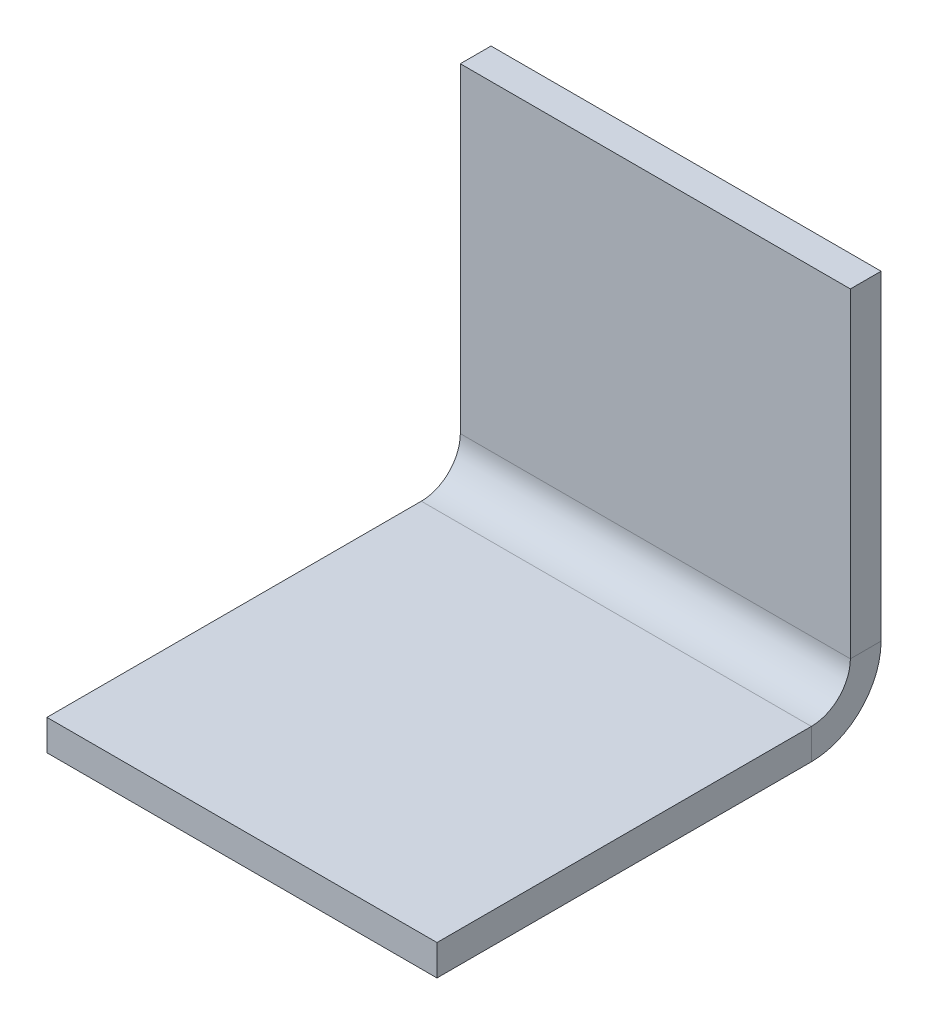
ISO-10303-21;
HEADER;
FILE_DESCRIPTION(('STEP AP214'),'2;1');
FILE_NAME('part.step','',(''),(''),'','','');
FILE_SCHEMA(('AUTOMOTIVE_DESIGN { 1 0 10303 214 1 1 1 1 }'));
ENDSEC;
DATA;
#1=APPLICATION_CONTEXT('core data for automotive mechanical design processes');
#2=APPLICATION_PROTOCOL_DEFINITION('international standard','automotive_design',2000,#1);
#3=PRODUCT_CONTEXT('',#1,'mechanical');
#4=PRODUCT('Part','Part','',(#3));
#5=PRODUCT_RELATED_PRODUCT_CATEGORY('part','',(#4));
#6=PRODUCT_DEFINITION_FORMATION('','',#4);
#7=PRODUCT_DEFINITION_CONTEXT('part definition',#1,'design');
#8=PRODUCT_DEFINITION('design','',#6,#7);
#9=PRODUCT_DEFINITION_SHAPE('','',#8);
#10=(LENGTH_UNIT() NAMED_UNIT(*) SI_UNIT(.MILLI.,.METRE.));
#11=(NAMED_UNIT(*) PLANE_ANGLE_UNIT() SI_UNIT($,.RADIAN.));
#12=(NAMED_UNIT(*) SI_UNIT($,.STERADIAN.) SOLID_ANGLE_UNIT());
#13=UNCERTAINTY_MEASURE_WITH_UNIT(LENGTH_MEASURE(1.E-05),#10,'distance_accuracy_value','');
#14=(GEOMETRIC_REPRESENTATION_CONTEXT(3) GLOBAL_UNCERTAINTY_ASSIGNED_CONTEXT((#13)) GLOBAL_UNIT_ASSIGNED_CONTEXT((#10,
#11,#12)) REPRESENTATION_CONTEXT('',''));
#15=CARTESIAN_POINT('',(0.,0.,0.));
#16=DIRECTION('',(0.,0.,1.));
#17=DIRECTION('',(1.,0.,0.));
#18=AXIS2_PLACEMENT_3D('',#15,#16,#17);
#19=CARTESIAN_POINT('',(0.,9.31212121212122,10.8315022152673));
#20=DIRECTION('',(0.,-1.,0.));
#21=DIRECTION('',(-1.,0.,0.));
#22=AXIS2_PLACEMENT_3D('',#19,#20,#21);
#23=PLANE('',#22);
#24=DIRECTION('',(0.,0.,-1.));
#25=VECTOR('',#24,1.);
#26=CARTESIAN_POINT('',(7.95353535353538,9.31212121212119,3.00624969001473));
#27=LINE('',#26,#25);
#28=CARTESIAN_POINT('',(7.95353535353538,9.31212121212128,28.919381003146));
#29=VERTEX_POINT('',#28);
#30=CARTESIAN_POINT('',(7.95353535353538,9.31212121212119,4.54000000000001));
#31=VERTEX_POINT('',#30);
#32=EDGE_CURVE('E54',#29,#31,#27,.T.);
#33=ORIENTED_EDGE('',*,*,#32,.T.);
#34=DIRECTION('',(-1.,0.,0.));
#35=VECTOR('',#34,1.);
#36=CARTESIAN_POINT('',(0.,9.31212121212119,4.54000000000002));
#37=LINE('',#36,#35);
#38=CARTESIAN_POINT('',(-17.4464646464646,9.3121212121212,4.54000000000001));
#39=VERTEX_POINT('',#38);
#40=EDGE_CURVE('E190',#31,#39,#37,.T.);
#41=ORIENTED_EDGE('',*,*,#40,.T.);
#42=DIRECTION('',(0.,0.,1.));
#43=VECTOR('',#42,1.);
#44=CARTESIAN_POINT('',(-17.4464646464646,9.31212121212111,-21.8806189968539));
#45=LINE('',#44,#43);
#46=CARTESIAN_POINT('',(-17.4464646464646,9.31212121212128,28.919381003146));
#47=VERTEX_POINT('',#46);
#48=EDGE_CURVE('E175',#39,#47,#45,.T.);
#49=ORIENTED_EDGE('',*,*,#48,.T.);
#50=DIRECTION('',(1.,0.,0.));
#51=VECTOR('',#50,1.);
#52=CARTESIAN_POINT('',(7.95353535353538,9.31212121212128,28.919381003146));
#53=LINE('',#52,#51);
#54=EDGE_CURVE('E179',#47,#29,#53,.T.);
#55=ORIENTED_EDGE('',*,*,#54,.T.);
#56=EDGE_LOOP('',(#33,#41,#49,#55));
#57=FACE_BOUND('',#56,.T.);
#58=ADVANCED_FACE('F50',(#57),#23,.F.);
#59=CARTESIAN_POINT('',(7.95353535353538,9.31212121212119,3.00624969001473));
#60=DIRECTION('',(-1.,0.,0.));
#61=DIRECTION('',(0.,0.,-1.));
#62=AXIS2_PLACEMENT_3D('',#59,#60,#61);
#63=PLANE('',#62);
#64=DIRECTION('',(0.,-1.,0.));
#65=VECTOR('',#64,1.);
#66=CARTESIAN_POINT('',(7.95353535353538,9.31212121212118,4.54000000000002));
#67=LINE('',#66,#65);
#68=CARTESIAN_POINT('',(7.95353535353538,7.31212121212119,4.54000000000001));
#69=VERTEX_POINT('',#68);
#70=EDGE_CURVE('E158',#31,#69,#67,.T.);
#71=ORIENTED_EDGE('',*,*,#70,.F.);
#72=ORIENTED_EDGE('',*,*,#32,.F.);
#73=DIRECTION('',(0.,1.,0.));
#74=VECTOR('',#73,1.);
#75=CARTESIAN_POINT('',(7.95353535353538,9.31212121212128,28.919381003146));
#76=LINE('',#75,#74);
#77=CARTESIAN_POINT('',(7.95353535353538,7.31212121212128,28.9193810031461));
#78=VERTEX_POINT('',#77);
#79=EDGE_CURVE('E82',#78,#29,#76,.T.);
#80=ORIENTED_EDGE('',*,*,#79,.F.);
#81=DIRECTION('',(0.,0.,-1.));
#82=VECTOR('',#81,1.);
#83=CARTESIAN_POINT('',(7.95353535353538,7.31212121212122,10.8315022152673));
#84=LINE('',#83,#82);
#85=EDGE_CURVE('E180',#78,#69,#84,.T.);
#86=ORIENTED_EDGE('',*,*,#85,.T.);
#87=EDGE_LOOP('',(#71,#72,#80,#86));
#88=FACE_BOUND('',#87,.T.);
#89=ADVANCED_FACE('F268',(#88),#63,.F.);
#90=CARTESIAN_POINT('',(-17.4464646464646,9.31212121212111,-21.8806189968539));
#91=DIRECTION('',(1.,0.,0.));
#92=DIRECTION('',(0.,0.,1.));
#93=AXIS2_PLACEMENT_3D('',#90,#91,#92);
#94=PLANE('',#93);
#95=DIRECTION('',(0.,1.,0.));
#96=VECTOR('',#95,1.);
#97=CARTESIAN_POINT('',(-17.4464646464646,9.31212121212102,4.54000000000002));
#98=LINE('',#97,#96);
#99=CARTESIAN_POINT('',(-17.4464646464646,7.31212121212119,4.54000000000001));
#100=VERTEX_POINT('',#99);
#101=EDGE_CURVE('E12',#100,#39,#98,.T.);
#102=ORIENTED_EDGE('',*,*,#101,.F.);
#103=DIRECTION('',(0.,0.,-1.));
#104=VECTOR('',#103,1.);
#105=CARTESIAN_POINT('',(-17.4464646464646,7.31212121212122,10.8315022152673));
#106=LINE('',#105,#104);
#107=CARTESIAN_POINT('',(-17.4464646464646,7.31212121212128,28.9193810031461));
#108=VERTEX_POINT('',#107);
#109=EDGE_CURVE('E99',#100,#108,#106,.F.);
#110=ORIENTED_EDGE('',*,*,#109,.T.);
#111=DIRECTION('',(0.,1.,0.));
#112=VECTOR('',#111,1.);
#113=CARTESIAN_POINT('',(-17.4464646464646,9.31212121212128,28.919381003146));
#114=LINE('',#113,#112);
#115=EDGE_CURVE('E176',#108,#47,#114,.T.);
#116=ORIENTED_EDGE('',*,*,#115,.T.);
#117=ORIENTED_EDGE('',*,*,#48,.F.);
#118=EDGE_LOOP('',(#102,#110,#116,#117));
#119=FACE_BOUND('',#118,.T.);
#120=ADVANCED_FACE('F52',(#119),#94,.F.);
#121=CARTESIAN_POINT('',(7.95353535353538,9.31212121212128,28.919381003146));
#122=DIRECTION('',(0.,0.,-1.));
#123=DIRECTION('',(1.,0.,0.));
#124=AXIS2_PLACEMENT_3D('',#121,#122,#123);
#125=PLANE('',#124);
#126=DIRECTION('',(-1.,0.,0.));
#127=VECTOR('',#126,1.);
#128=CARTESIAN_POINT('',(0.,7.31212121212128,28.9193810031461));
#129=LINE('',#128,#127);
#130=EDGE_CURVE('E171',#108,#78,#129,.F.);
#131=ORIENTED_EDGE('',*,*,#130,.T.);
#132=ORIENTED_EDGE('',*,*,#79,.T.);
#133=ORIENTED_EDGE('',*,*,#54,.F.);
#134=ORIENTED_EDGE('',*,*,#115,.F.);
#135=EDGE_LOOP('',(#131,#132,#133,#134));
#136=FACE_BOUND('',#135,.T.);
#137=ADVANCED_FACE('F276',(#136),#125,.F.);
#138=CARTESIAN_POINT('',(0.,7.31212121212122,10.8315022152673));
#139=DIRECTION('',(0.,-1.,0.));
#140=DIRECTION('',(-1.,0.,0.));
#141=AXIS2_PLACEMENT_3D('',#138,#139,#140);
#142=PLANE('',#141);
#143=DIRECTION('',(-1.,0.,0.));
#144=VECTOR('',#143,1.);
#145=CARTESIAN_POINT('',(0.,7.3121212121212,4.54000000000001));
#146=LINE('',#145,#144);
#147=EDGE_CURVE('E60',#69,#100,#146,.T.);
#148=ORIENTED_EDGE('',*,*,#147,.F.);
#149=ORIENTED_EDGE('',*,*,#85,.F.);
#150=ORIENTED_EDGE('',*,*,#130,.F.);
#151=ORIENTED_EDGE('',*,*,#109,.F.);
#152=EDGE_LOOP('',(#148,#149,#150,#151));
#153=FACE_BOUND('',#152,.T.);
#154=ADVANCED_FACE('F170',(#153),#142,.T.);
#155=CARTESIAN_POINT('',(-17.4464646464646,32.7121212121212,2.));
#156=DIRECTION('',(0.,-1.,0.));
#157=DIRECTION('',(-1.,0.,0.));
#158=AXIS2_PLACEMENT_3D('',#155,#156,#157);
#159=PLANE('',#158);
#160=DIRECTION('',(0.,0.,1.));
#161=VECTOR('',#160,1.);
#162=CARTESIAN_POINT('',(7.95353535353538,32.7121212121212,2.));
#163=LINE('',#162,#161);
#164=CARTESIAN_POINT('',(7.95353535353538,32.7121212121212,0.));
#165=VERTEX_POINT('',#164);
#166=CARTESIAN_POINT('',(7.95353535353538,32.7121212121212,2.));
#167=VERTEX_POINT('',#166);
#168=EDGE_CURVE('E224',#165,#167,#163,.T.);
#169=ORIENTED_EDGE('',*,*,#168,.F.);
#170=DIRECTION('',(-1.,0.,0.));
#171=VECTOR('',#170,1.);
#172=CARTESIAN_POINT('',(0.,32.7121212121212,0.));
#173=LINE('',#172,#171);
#174=CARTESIAN_POINT('',(-17.4464646464646,32.7121212121212,0.));
#175=VERTEX_POINT('',#174);
#176=EDGE_CURVE('E201',#165,#175,#173,.T.);
#177=ORIENTED_EDGE('',*,*,#176,.T.);
#178=DIRECTION('',(0.,0.,1.));
#179=VECTOR('',#178,1.);
#180=CARTESIAN_POINT('',(-17.4464646464646,32.7121212121212,2.));
#181=LINE('',#180,#179);
#182=CARTESIAN_POINT('',(-17.4464646464646,32.7121212121212,2.));
#183=VERTEX_POINT('',#182);
#184=EDGE_CURVE('E111',#175,#183,#181,.T.);
#185=ORIENTED_EDGE('',*,*,#184,.T.);
#186=DIRECTION('',(-1.,0.,0.));
#187=VECTOR('',#186,1.);
#188=CARTESIAN_POINT('',(-17.4464646464646,32.7121212121212,2.));
#189=LINE('',#188,#187);
#190=EDGE_CURVE('E210',#167,#183,#189,.T.);
#191=ORIENTED_EDGE('',*,*,#190,.F.);
#192=EDGE_LOOP('',(#169,#177,#185,#191));
#193=FACE_BOUND('',#192,.T.);
#194=ADVANCED_FACE('F254',(#193),#159,.F.);
#195=CARTESIAN_POINT('',(0.,0.,2.));
#196=DIRECTION('',(0.,0.,-1.));
#197=DIRECTION('',(-1.,0.,0.));
#198=AXIS2_PLACEMENT_3D('',#195,#196,#197);
#199=PLANE('',#198);
#200=DIRECTION('',(-1.,0.,0.));
#201=VECTOR('',#200,1.);
#202=CARTESIAN_POINT('',(0.,11.8521212121212,2.));
#203=LINE('',#202,#201);
#204=CARTESIAN_POINT('',(7.95353535353538,11.8521212121212,2.));
#205=VERTEX_POINT('',#204);
#206=CARTESIAN_POINT('',(-17.4464646464646,11.8521212121212,2.));
#207=VERTEX_POINT('',#206);
#208=EDGE_CURVE('E140',#205,#207,#203,.T.);
#209=ORIENTED_EDGE('',*,*,#208,.F.);
#210=DIRECTION('',(0.,1.,0.));
#211=VECTOR('',#210,1.);
#212=CARTESIAN_POINT('',(7.95353535353538,7.82525252525253,2.));
#213=LINE('',#212,#211);
#214=EDGE_CURVE('E207',#205,#167,#213,.T.);
#215=ORIENTED_EDGE('',*,*,#214,.T.);
#216=ORIENTED_EDGE('',*,*,#190,.T.);
#217=DIRECTION('',(0.,-1.,0.));
#218=VECTOR('',#217,1.);
#219=CARTESIAN_POINT('',(-17.4464646464646,32.7121212121212,2.));
#220=LINE('',#219,#218);
#221=EDGE_CURVE('E214',#183,#207,#220,.T.);
#222=ORIENTED_EDGE('',*,*,#221,.T.);
#223=EDGE_LOOP('',(#209,#215,#216,#222));
#224=FACE_BOUND('',#223,.T.);
#225=ADVANCED_FACE('F246',(#224),#199,.F.);
#226=CARTESIAN_POINT('',(7.95353535353538,7.82525252525253,2.));
#227=DIRECTION('',(-1.,0.,0.));
#228=DIRECTION('',(0.,1.,0.));
#229=AXIS2_PLACEMENT_3D('',#226,#227,#228);
#230=PLANE('',#229);
#231=ORIENTED_EDGE('',*,*,#214,.F.);
#232=DIRECTION('',(0.,0.,-1.));
#233=VECTOR('',#232,1.);
#234=CARTESIAN_POINT('',(7.95353535353538,11.8521212121212,2.00000000000003));
#235=LINE('',#234,#233);
#236=CARTESIAN_POINT('',(7.95353535353538,11.8521212121212,0.));
#237=VERTEX_POINT('',#236);
#238=EDGE_CURVE('E218',#205,#237,#235,.T.);
#239=ORIENTED_EDGE('',*,*,#238,.T.);
#240=DIRECTION('',(0.,1.,0.));
#241=VECTOR('',#240,1.);
#242=CARTESIAN_POINT('',(7.95353535353538,0.,0.));
#243=LINE('',#242,#241);
#244=EDGE_CURVE('E222',#237,#165,#243,.T.);
#245=ORIENTED_EDGE('',*,*,#244,.T.);
#246=ORIENTED_EDGE('',*,*,#168,.T.);
#247=EDGE_LOOP('',(#231,#239,#245,#246));
#248=FACE_BOUND('',#247,.T.);
#249=ADVANCED_FACE('F248',(#248),#230,.F.);
#250=CARTESIAN_POINT('',(0.,0.,0.));
#251=DIRECTION('',(0.,0.,-1.));
#252=DIRECTION('',(-1.,0.,0.));
#253=AXIS2_PLACEMENT_3D('',#250,#251,#252);
#254=PLANE('',#253);
#255=ORIENTED_EDGE('',*,*,#244,.F.);
#256=DIRECTION('',(-1.,0.,0.));
#257=VECTOR('',#256,1.);
#258=CARTESIAN_POINT('',(0.,11.8521212121212,0.));
#259=LINE('',#258,#257);
#260=CARTESIAN_POINT('',(-17.4464646464646,11.8521212121212,0.));
#261=VERTEX_POINT('',#260);
#262=EDGE_CURVE('E228',#237,#261,#259,.T.);
#263=ORIENTED_EDGE('',*,*,#262,.T.);
#264=DIRECTION('',(0.,1.,0.));
#265=VECTOR('',#264,1.);
#266=CARTESIAN_POINT('',(-17.4464646464646,0.,0.));
#267=LINE('',#266,#265);
#268=EDGE_CURVE('E232',#175,#261,#267,.F.);
#269=ORIENTED_EDGE('',*,*,#268,.F.);
#270=ORIENTED_EDGE('',*,*,#176,.F.);
#271=EDGE_LOOP('',(#255,#263,#269,#270));
#272=FACE_BOUND('',#271,.T.);
#273=ADVANCED_FACE('F257',(#272),#254,.T.);
#274=CARTESIAN_POINT('',(-17.4464646464646,32.7121212121212,2.));
#275=DIRECTION('',(1.,0.,0.));
#276=DIRECTION('',(0.,-1.,0.));
#277=AXIS2_PLACEMENT_3D('',#274,#275,#276);
#278=PLANE('',#277);
#279=ORIENTED_EDGE('',*,*,#268,.T.);
#280=DIRECTION('',(0.,0.,1.));
#281=VECTOR('',#280,1.);
#282=CARTESIAN_POINT('',(-17.4464646464646,11.8521212121212,1.99999999999985));
#283=LINE('',#282,#281);
#284=EDGE_CURVE('E165',#261,#207,#283,.T.);
#285=ORIENTED_EDGE('',*,*,#284,.T.);
#286=ORIENTED_EDGE('',*,*,#221,.F.);
#287=ORIENTED_EDGE('',*,*,#184,.F.);
#288=EDGE_LOOP('',(#279,#285,#286,#287));
#289=FACE_BOUND('',#288,.T.);
#290=ADVANCED_FACE('F255',(#289),#278,.F.);
#291=CARTESIAN_POINT('',(7.95353535353538,11.8521212121212,4.54));
#292=DIRECTION('',(-1.,0.,0.));
#293=DIRECTION('',(0.,0.,1.));
#294=AXIS2_PLACEMENT_3D('',#291,#292,#293);
#295=PLANE('',#294);
#296=ORIENTED_EDGE('',*,*,#70,.T.);
#297=CARTESIAN_POINT('',(7.95353535353538,11.8521212121212,4.54));
#298=DIRECTION('',(1.,0.,0.));
#299=DIRECTION('',(0.,1.,0.));
#300=AXIS2_PLACEMENT_3D('',#297,#298,#299);
#301=CIRCLE('',#300,4.54);
#302=EDGE_CURVE('E133',#69,#237,#301,.T.);
#303=ORIENTED_EDGE('',*,*,#302,.T.);
#304=ORIENTED_EDGE('',*,*,#238,.F.);
#305=CARTESIAN_POINT('',(7.95353535353538,11.8521212121212,4.54));
#306=DIRECTION('',(1.,0.,0.));
#307=DIRECTION('',(0.,0.,-1.));
#308=AXIS2_PLACEMENT_3D('',#305,#306,#307);
#309=CIRCLE('',#308,2.54);
#310=EDGE_CURVE('E167',#31,#205,#309,.T.);
#311=ORIENTED_EDGE('',*,*,#310,.F.);
#312=EDGE_LOOP('',(#296,#303,#304,#311));
#313=FACE_BOUND('',#312,.T.);
#314=ADVANCED_FACE('F264',(#313),#295,.F.);
#315=CARTESIAN_POINT('',(-17.4464646464646,11.8521212121212,4.54));
#316=DIRECTION('',(1.,0.,0.));
#317=DIRECTION('',(0.,0.,-1.));
#318=AXIS2_PLACEMENT_3D('',#315,#316,#317);
#319=PLANE('',#318);
#320=CARTESIAN_POINT('',(-17.4464646464646,11.8521212121212,4.54));
#321=DIRECTION('',(1.,0.,0.));
#322=DIRECTION('',(0.,1.,0.));
#323=AXIS2_PLACEMENT_3D('',#320,#321,#322);
#324=CIRCLE('',#323,4.54);
#325=EDGE_CURVE('E153',#261,#100,#324,.F.);
#326=ORIENTED_EDGE('',*,*,#325,.T.);
#327=ORIENTED_EDGE('',*,*,#101,.T.);
#328=CARTESIAN_POINT('',(-17.4464646464646,11.8521212121212,4.54));
#329=DIRECTION('',(-1.,0.,0.));
#330=DIRECTION('',(0.,0.,1.));
#331=AXIS2_PLACEMENT_3D('',#328,#329,#330);
#332=CIRCLE('',#331,2.54);
#333=EDGE_CURVE('E71',#207,#39,#332,.T.);
#334=ORIENTED_EDGE('',*,*,#333,.F.);
#335=ORIENTED_EDGE('',*,*,#284,.F.);
#336=EDGE_LOOP('',(#326,#327,#334,#335));
#337=FACE_BOUND('',#336,.T.);
#338=ADVANCED_FACE('F162',(#337),#319,.F.);
#339=CARTESIAN_POINT('',(-30.8248174247398,11.8521212121212,4.54));
#340=DIRECTION('',(1.,0.,0.));
#341=DIRECTION('',(0.,1.,0.));
#342=AXIS2_PLACEMENT_3D('',#339,#340,#341);
#343=CYLINDRICAL_SURFACE('',#342,2.54);
#344=ORIENTED_EDGE('',*,*,#208,.T.);
#345=ORIENTED_EDGE('',*,*,#333,.T.);
#346=ORIENTED_EDGE('',*,*,#40,.F.);
#347=ORIENTED_EDGE('',*,*,#310,.T.);
#348=EDGE_LOOP('',(#344,#345,#346,#347));
#349=FACE_BOUND('',#348,.T.);
#350=ADVANCED_FACE('F242',(#349),#343,.F.);
#351=CARTESIAN_POINT('',(-30.8248174247398,11.8521212121212,4.54));
#352=DIRECTION('',(1.,0.,0.));
#353=DIRECTION('',(0.,1.,0.));
#354=AXIS2_PLACEMENT_3D('',#351,#352,#353);
#355=CYLINDRICAL_SURFACE('',#354,4.54);
#356=ORIENTED_EDGE('',*,*,#262,.F.);
#357=ORIENTED_EDGE('',*,*,#302,.F.);
#358=ORIENTED_EDGE('',*,*,#147,.T.);
#359=ORIENTED_EDGE('',*,*,#325,.F.);
#360=EDGE_LOOP('',(#356,#357,#358,#359));
#361=FACE_BOUND('',#360,.T.);
#362=ADVANCED_FACE('F152',(#361),#355,.T.);
#363=CLOSED_SHELL('',(#58,#89,#120,#137,#154,#194,#225,#249,#273,#290,#314,#338,#350,#362));
#364=MANIFOLD_SOLID_BREP('B2',#363);
#365=ADVANCED_BREP_SHAPE_REPRESENTATION('',(#18,#364),#14);
#366=SHAPE_DEFINITION_REPRESENTATION(#9,#365);
ENDSEC;
END-ISO-10303-21;
